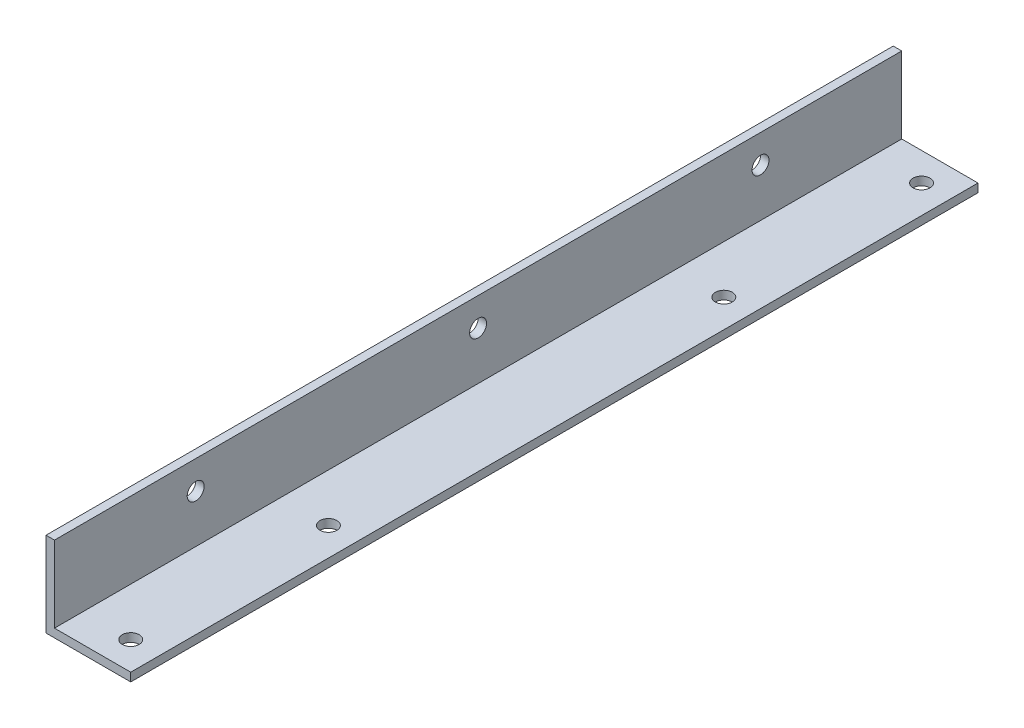
ISO-10303-21;
HEADER;
FILE_DESCRIPTION(('STEP AP214'),'2;1');
FILE_NAME('part.step','',(''),(''),'','','');
FILE_SCHEMA(('AUTOMOTIVE_DESIGN { 1 0 10303 214 1 1 1 1 }'));
ENDSEC;
DATA;
#1=APPLICATION_CONTEXT('core data for automotive mechanical design processes');
#2=APPLICATION_PROTOCOL_DEFINITION('international standard','automotive_design',2000,#1);
#3=PRODUCT_CONTEXT('',#1,'mechanical');
#4=PRODUCT('Part','Part','',(#3));
#5=PRODUCT_RELATED_PRODUCT_CATEGORY('part','',(#4));
#6=PRODUCT_DEFINITION_FORMATION('','',#4);
#7=PRODUCT_DEFINITION_CONTEXT('part definition',#1,'design');
#8=PRODUCT_DEFINITION('design','',#6,#7);
#9=PRODUCT_DEFINITION_SHAPE('','',#8);
#10=(LENGTH_UNIT() NAMED_UNIT(*) SI_UNIT(.MILLI.,.METRE.));
#11=(NAMED_UNIT(*) PLANE_ANGLE_UNIT() SI_UNIT($,.RADIAN.));
#12=(NAMED_UNIT(*) SI_UNIT($,.STERADIAN.) SOLID_ANGLE_UNIT());
#13=UNCERTAINTY_MEASURE_WITH_UNIT(LENGTH_MEASURE(1.E-05),#10,'distance_accuracy_value','');
#14=(GEOMETRIC_REPRESENTATION_CONTEXT(3) GLOBAL_UNCERTAINTY_ASSIGNED_CONTEXT((#13)) GLOBAL_UNIT_ASSIGNED_CONTEXT((#10,
#11,#12)) REPRESENTATION_CONTEXT('',''));
#15=CARTESIAN_POINT('',(0.,0.,0.));
#16=DIRECTION('',(0.,0.,1.));
#17=DIRECTION('',(1.,0.,0.));
#18=AXIS2_PLACEMENT_3D('',#15,#16,#17);
#19=CARTESIAN_POINT('',(0.,0.,-75.));
#20=DIRECTION('',(-1.,0.,0.));
#21=DIRECTION('',(0.,0.,1.));
#22=AXIS2_PLACEMENT_3D('',#19,#20,#21);
#23=PLANE('',#22);
#24=CARTESIAN_POINT('',(0.,10.,0.));
#25=DIRECTION('',(1.,0.,0.));
#26=DIRECTION('',(0.,0.,-1.));
#27=AXIS2_PLACEMENT_3D('',#24,#25,#26);
#28=CIRCLE('',#27,1.5);
#29=CARTESIAN_POINT('',(0.,10.,-1.5));
#30=VERTEX_POINT('',#29);
#31=EDGE_CURVE('E226',#30,#30,#28,.T.);
#32=ORIENTED_EDGE('',*,*,#31,.T.);
#33=EDGE_LOOP('',(#32));
#34=FACE_BOUND('',#33,.T.);
#35=CARTESIAN_POINT('',(0.,10.,50.));
#36=DIRECTION('',(1.,0.,0.));
#37=DIRECTION('',(0.,0.,-1.));
#38=AXIS2_PLACEMENT_3D('',#35,#36,#37);
#39=CIRCLE('',#38,1.5);
#40=CARTESIAN_POINT('',(0.,10.,48.5));
#41=VERTEX_POINT('',#40);
#42=EDGE_CURVE('E108',#41,#41,#39,.T.);
#43=ORIENTED_EDGE('',*,*,#42,.T.);
#44=EDGE_LOOP('',(#43));
#45=FACE_BOUND('',#44,.T.);
#46=DIRECTION('',(0.,0.,1.));
#47=VECTOR('',#46,1.);
#48=CARTESIAN_POINT('',(0.,0.,-75.));
#49=LINE('',#48,#47);
#50=CARTESIAN_POINT('',(0.,0.,-75.));
#51=VERTEX_POINT('',#50);
#52=CARTESIAN_POINT('',(0.,0.,75.));
#53=VERTEX_POINT('',#52);
#54=EDGE_CURVE('E83',#51,#53,#49,.T.);
#55=ORIENTED_EDGE('',*,*,#54,.T.);
#56=DIRECTION('',(0.,-1.,0.));
#57=VECTOR('',#56,1.);
#58=CARTESIAN_POINT('',(0.,0.,75.));
#59=LINE('',#58,#57);
#60=CARTESIAN_POINT('',(0.,15.,75.));
#61=VERTEX_POINT('',#60);
#62=EDGE_CURVE('E87',#61,#53,#59,.T.);
#63=ORIENTED_EDGE('',*,*,#62,.F.);
#64=DIRECTION('',(0.,0.,1.));
#65=VECTOR('',#64,1.);
#66=CARTESIAN_POINT('',(0.,15.,-75.));
#67=LINE('',#66,#65);
#68=CARTESIAN_POINT('',(0.,15.,-75.));
#69=VERTEX_POINT('',#68);
#70=EDGE_CURVE('E46',#69,#61,#67,.T.);
#71=ORIENTED_EDGE('',*,*,#70,.F.);
#72=DIRECTION('',(0.,-1.,0.));
#73=VECTOR('',#72,1.);
#74=CARTESIAN_POINT('',(0.,0.,-75.));
#75=LINE('',#74,#73);
#76=EDGE_CURVE('E88',#69,#51,#75,.T.);
#77=ORIENTED_EDGE('',*,*,#76,.T.);
#78=EDGE_LOOP('',(#55,#63,#71,#77));
#79=FACE_BOUND('',#78,.T.);
#80=CARTESIAN_POINT('',(0.,10.,-50.));
#81=DIRECTION('',(1.,0.,0.));
#82=DIRECTION('',(0.,0.,-1.));
#83=AXIS2_PLACEMENT_3D('',#80,#81,#82);
#84=CIRCLE('',#83,1.5);
#85=CARTESIAN_POINT('',(0.,10.,-51.5));
#86=VERTEX_POINT('',#85);
#87=EDGE_CURVE('E135',#86,#86,#84,.T.);
#88=ORIENTED_EDGE('',*,*,#87,.T.);
#89=EDGE_LOOP('',(#88));
#90=FACE_BOUND('',#89,.T.);
#91=ADVANCED_FACE('F31',(#34,#45,#79,#90),#23,.T.);
#92=CARTESIAN_POINT('',(0.,15.,-75.));
#93=DIRECTION('',(0.,1.,0.));
#94=DIRECTION('',(-1.,0.,0.));
#95=AXIS2_PLACEMENT_3D('',#92,#93,#94);
#96=PLANE('',#95);
#97=ORIENTED_EDGE('',*,*,#70,.T.);
#98=DIRECTION('',(-1.,0.,0.));
#99=VECTOR('',#98,1.);
#100=CARTESIAN_POINT('',(0.,15.,75.));
#101=LINE('',#100,#99);
#102=CARTESIAN_POINT('',(1.5,15.,75.));
#103=VERTEX_POINT('',#102);
#104=EDGE_CURVE('E107',#103,#61,#101,.T.);
#105=ORIENTED_EDGE('',*,*,#104,.F.);
#106=DIRECTION('',(0.,0.,1.));
#107=VECTOR('',#106,1.);
#108=CARTESIAN_POINT('',(1.5,15.,-75.));
#109=LINE('',#108,#107);
#110=CARTESIAN_POINT('',(1.5,15.,-75.));
#111=VERTEX_POINT('',#110);
#112=EDGE_CURVE('E54',#111,#103,#109,.T.);
#113=ORIENTED_EDGE('',*,*,#112,.F.);
#114=DIRECTION('',(-1.,0.,0.));
#115=VECTOR('',#114,1.);
#116=CARTESIAN_POINT('',(0.,15.,-75.));
#117=LINE('',#116,#115);
#118=EDGE_CURVE('E92',#111,#69,#117,.T.);
#119=ORIENTED_EDGE('',*,*,#118,.T.);
#120=EDGE_LOOP('',(#97,#105,#113,#119));
#121=FACE_BOUND('',#120,.T.);
#122=ADVANCED_FACE('F169',(#121),#96,.T.);
#123=CARTESIAN_POINT('',(1.5,1.5,-75.));
#124=DIRECTION('',(1.,0.,0.));
#125=DIRECTION('',(0.,0.,-1.));
#126=AXIS2_PLACEMENT_3D('',#123,#124,#125);
#127=PLANE('',#126);
#128=CARTESIAN_POINT('',(1.5,10.,0.));
#129=DIRECTION('',(1.,0.,0.));
#130=DIRECTION('',(0.,0.,-1.));
#131=AXIS2_PLACEMENT_3D('',#128,#129,#130);
#132=CIRCLE('',#131,1.5);
#133=CARTESIAN_POINT('',(1.5,10.,-1.5));
#134=VERTEX_POINT('',#133);
#135=EDGE_CURVE('E221',#134,#134,#132,.T.);
#136=ORIENTED_EDGE('',*,*,#135,.F.);
#137=EDGE_LOOP('',(#136));
#138=FACE_BOUND('',#137,.T.);
#139=CARTESIAN_POINT('',(1.5,10.,50.));
#140=DIRECTION('',(1.,0.,0.));
#141=DIRECTION('',(0.,0.,-1.));
#142=AXIS2_PLACEMENT_3D('',#139,#140,#141);
#143=CIRCLE('',#142,1.5);
#144=CARTESIAN_POINT('',(1.5,10.,48.5));
#145=VERTEX_POINT('',#144);
#146=EDGE_CURVE('E111',#145,#145,#143,.T.);
#147=ORIENTED_EDGE('',*,*,#146,.F.);
#148=EDGE_LOOP('',(#147));
#149=FACE_BOUND('',#148,.T.);
#150=ORIENTED_EDGE('',*,*,#112,.T.);
#151=DIRECTION('',(0.,1.,0.));
#152=VECTOR('',#151,1.);
#153=CARTESIAN_POINT('',(1.5,1.5,75.));
#154=LINE('',#153,#152);
#155=CARTESIAN_POINT('',(1.5,1.5,75.));
#156=VERTEX_POINT('',#155);
#157=EDGE_CURVE('E119',#156,#103,#154,.T.);
#158=ORIENTED_EDGE('',*,*,#157,.F.);
#159=DIRECTION('',(0.,0.,1.));
#160=VECTOR('',#159,1.);
#161=CARTESIAN_POINT('',(1.5,1.5,-75.));
#162=LINE('',#161,#160);
#163=CARTESIAN_POINT('',(1.5,1.5,-75.));
#164=VERTEX_POINT('',#163);
#165=EDGE_CURVE('E137',#164,#156,#162,.T.);
#166=ORIENTED_EDGE('',*,*,#165,.F.);
#167=DIRECTION('',(0.,1.,0.));
#168=VECTOR('',#167,1.);
#169=CARTESIAN_POINT('',(1.5,1.5,-75.));
#170=LINE('',#169,#168);
#171=EDGE_CURVE('E131',#164,#111,#170,.T.);
#172=ORIENTED_EDGE('',*,*,#171,.T.);
#173=EDGE_LOOP('',(#150,#158,#166,#172));
#174=FACE_BOUND('',#173,.T.);
#175=CARTESIAN_POINT('',(1.5,10.,-50.));
#176=DIRECTION('',(1.,0.,0.));
#177=DIRECTION('',(0.,0.,-1.));
#178=AXIS2_PLACEMENT_3D('',#175,#176,#177);
#179=CIRCLE('',#178,1.5);
#180=CARTESIAN_POINT('',(1.5,10.,-51.5));
#181=VERTEX_POINT('',#180);
#182=EDGE_CURVE('E144',#181,#181,#179,.T.);
#183=ORIENTED_EDGE('',*,*,#182,.F.);
#184=EDGE_LOOP('',(#183));
#185=FACE_BOUND('',#184,.T.);
#186=ADVANCED_FACE('F160',(#138,#149,#174,#185),#127,.T.);
#187=CARTESIAN_POINT('',(1.5,1.5,-75.));
#188=DIRECTION('',(0.,1.,0.));
#189=DIRECTION('',(0.,0.,1.));
#190=AXIS2_PLACEMENT_3D('',#187,#188,#189);
#191=PLANE('',#190);
#192=CARTESIAN_POINT('',(10.,1.5,35.));
#193=DIRECTION('',(0.,1.,0.));
#194=DIRECTION('',(0.,0.,1.));
#195=AXIS2_PLACEMENT_3D('',#192,#193,#194);
#196=CIRCLE('',#195,1.5);
#197=CARTESIAN_POINT('',(10.,1.5,33.5));
#198=VERTEX_POINT('',#197);
#199=EDGE_CURVE('E231',#198,#198,#196,.T.);
#200=ORIENTED_EDGE('',*,*,#199,.F.);
#201=EDGE_LOOP('',(#200));
#202=FACE_BOUND('',#201,.T.);
#203=CARTESIAN_POINT('',(10.,1.5,70.));
#204=DIRECTION('',(0.,1.,0.));
#205=DIRECTION('',(0.,0.,1.));
#206=AXIS2_PLACEMENT_3D('',#203,#204,#205);
#207=CIRCLE('',#206,1.5);
#208=CARTESIAN_POINT('',(10.,1.5,68.5));
#209=VERTEX_POINT('',#208);
#210=EDGE_CURVE('E220',#209,#209,#207,.T.);
#211=ORIENTED_EDGE('',*,*,#210,.F.);
#212=EDGE_LOOP('',(#211));
#213=FACE_BOUND('',#212,.T.);
#214=ORIENTED_EDGE('',*,*,#165,.T.);
#215=DIRECTION('',(-1.,0.,0.));
#216=VECTOR('',#215,1.);
#217=CARTESIAN_POINT('',(1.5,1.5,75.));
#218=LINE('',#217,#216);
#219=CARTESIAN_POINT('',(15.,1.5,75.));
#220=VERTEX_POINT('',#219);
#221=EDGE_CURVE('E116',#220,#156,#218,.T.);
#222=ORIENTED_EDGE('',*,*,#221,.F.);
#223=DIRECTION('',(0.,0.,1.));
#224=VECTOR('',#223,1.);
#225=CARTESIAN_POINT('',(15.,1.5,-75.));
#226=LINE('',#225,#224);
#227=CARTESIAN_POINT('',(15.,1.5,-75.));
#228=VERTEX_POINT('',#227);
#229=EDGE_CURVE('E139',#228,#220,#226,.T.);
#230=ORIENTED_EDGE('',*,*,#229,.F.);
#231=DIRECTION('',(-1.,0.,0.));
#232=VECTOR('',#231,1.);
#233=CARTESIAN_POINT('',(1.5,1.5,-75.));
#234=LINE('',#233,#232);
#235=EDGE_CURVE('E128',#228,#164,#234,.T.);
#236=ORIENTED_EDGE('',*,*,#235,.T.);
#237=EDGE_LOOP('',(#214,#222,#230,#236));
#238=FACE_BOUND('',#237,.T.);
#239=CARTESIAN_POINT('',(10.,1.5,-35.));
#240=DIRECTION('',(0.,1.,0.));
#241=DIRECTION('',(0.,0.,1.));
#242=AXIS2_PLACEMENT_3D('',#239,#240,#241);
#243=CIRCLE('',#242,1.5);
#244=CARTESIAN_POINT('',(10.,1.5,-36.5));
#245=VERTEX_POINT('',#244);
#246=EDGE_CURVE('E147',#245,#245,#243,.T.);
#247=ORIENTED_EDGE('',*,*,#246,.F.);
#248=EDGE_LOOP('',(#247));
#249=FACE_BOUND('',#248,.T.);
#250=CARTESIAN_POINT('',(10.,1.5,-70.));
#251=DIRECTION('',(0.,1.,0.));
#252=DIRECTION('',(0.,0.,1.));
#253=AXIS2_PLACEMENT_3D('',#250,#251,#252);
#254=CIRCLE('',#253,1.5);
#255=CARTESIAN_POINT('',(10.,1.5,-71.5));
#256=VERTEX_POINT('',#255);
#257=EDGE_CURVE('E39',#256,#256,#254,.T.);
#258=ORIENTED_EDGE('',*,*,#257,.F.);
#259=EDGE_LOOP('',(#258));
#260=FACE_BOUND('',#259,.T.);
#261=ADVANCED_FACE('F157',(#202,#213,#238,#249,#260),#191,.T.);
#262=CARTESIAN_POINT('',(15.,0.,-75.));
#263=DIRECTION('',(1.,0.,0.));
#264=DIRECTION('',(0.,0.,-1.));
#265=AXIS2_PLACEMENT_3D('',#262,#263,#264);
#266=PLANE('',#265);
#267=ORIENTED_EDGE('',*,*,#229,.T.);
#268=DIRECTION('',(0.,1.,0.));
#269=VECTOR('',#268,1.);
#270=CARTESIAN_POINT('',(15.,0.,75.));
#271=LINE('',#270,#269);
#272=CARTESIAN_POINT('',(15.,0.,75.));
#273=VERTEX_POINT('',#272);
#274=EDGE_CURVE('E102',#273,#220,#271,.T.);
#275=ORIENTED_EDGE('',*,*,#274,.F.);
#276=DIRECTION('',(0.,0.,1.));
#277=VECTOR('',#276,1.);
#278=CARTESIAN_POINT('',(15.,0.,-75.));
#279=LINE('',#278,#277);
#280=CARTESIAN_POINT('',(15.,0.,-75.));
#281=VERTEX_POINT('',#280);
#282=EDGE_CURVE('E91',#281,#273,#279,.T.);
#283=ORIENTED_EDGE('',*,*,#282,.F.);
#284=DIRECTION('',(0.,1.,0.));
#285=VECTOR('',#284,1.);
#286=CARTESIAN_POINT('',(15.,0.,-75.));
#287=LINE('',#286,#285);
#288=EDGE_CURVE('E125',#281,#228,#287,.T.);
#289=ORIENTED_EDGE('',*,*,#288,.T.);
#290=EDGE_LOOP('',(#267,#275,#283,#289));
#291=FACE_BOUND('',#290,.T.);
#292=ADVANCED_FACE('F159',(#291),#266,.T.);
#293=CARTESIAN_POINT('',(2.,0.,-75.));
#294=DIRECTION('',(0.,-1.,0.));
#295=DIRECTION('',(0.,0.,-1.));
#296=AXIS2_PLACEMENT_3D('',#293,#294,#295);
#297=PLANE('',#296);
#298=CARTESIAN_POINT('',(10.,0.,35.));
#299=DIRECTION('',(0.,-1.,0.));
#300=DIRECTION('',(0.,0.,-1.));
#301=AXIS2_PLACEMENT_3D('',#298,#299,#300);
#302=CIRCLE('',#301,1.5);
#303=CARTESIAN_POINT('',(10.,0.,33.5));
#304=VERTEX_POINT('',#303);
#305=EDGE_CURVE('E215',#304,#304,#302,.T.);
#306=ORIENTED_EDGE('',*,*,#305,.F.);
#307=EDGE_LOOP('',(#306));
#308=FACE_BOUND('',#307,.T.);
#309=CARTESIAN_POINT('',(10.,0.,70.));
#310=DIRECTION('',(0.,-1.,0.));
#311=DIRECTION('',(0.,0.,-1.));
#312=AXIS2_PLACEMENT_3D('',#309,#310,#311);
#313=CIRCLE('',#312,1.5);
#314=CARTESIAN_POINT('',(10.,0.,68.5));
#315=VERTEX_POINT('',#314);
#316=EDGE_CURVE('E218',#315,#315,#313,.T.);
#317=ORIENTED_EDGE('',*,*,#316,.F.);
#318=EDGE_LOOP('',(#317));
#319=FACE_BOUND('',#318,.T.);
#320=ORIENTED_EDGE('',*,*,#282,.T.);
#321=DIRECTION('',(1.,0.,0.));
#322=VECTOR('',#321,1.);
#323=CARTESIAN_POINT('',(0.,0.,75.));
#324=LINE('',#323,#322);
#325=EDGE_CURVE('E95',#53,#273,#324,.T.);
#326=ORIENTED_EDGE('',*,*,#325,.F.);
#327=ORIENTED_EDGE('',*,*,#54,.F.);
#328=DIRECTION('',(1.,0.,0.));
#329=VECTOR('',#328,1.);
#330=CARTESIAN_POINT('',(0.,0.,-75.));
#331=LINE('',#330,#329);
#332=EDGE_CURVE('E123',#51,#281,#331,.T.);
#333=ORIENTED_EDGE('',*,*,#332,.T.);
#334=EDGE_LOOP('',(#320,#326,#327,#333));
#335=FACE_BOUND('',#334,.T.);
#336=CARTESIAN_POINT('',(10.,0.,-35.));
#337=DIRECTION('',(0.,-1.,0.));
#338=DIRECTION('',(0.,0.,-1.));
#339=AXIS2_PLACEMENT_3D('',#336,#337,#338);
#340=CIRCLE('',#339,1.5);
#341=CARTESIAN_POINT('',(10.,0.,-36.5));
#342=VERTEX_POINT('',#341);
#343=EDGE_CURVE('E150',#342,#342,#340,.T.);
#344=ORIENTED_EDGE('',*,*,#343,.F.);
#345=EDGE_LOOP('',(#344));
#346=FACE_BOUND('',#345,.T.);
#347=CARTESIAN_POINT('',(10.,0.,-70.));
#348=DIRECTION('',(0.,-1.,0.));
#349=DIRECTION('',(0.,0.,-1.));
#350=AXIS2_PLACEMENT_3D('',#347,#348,#349);
#351=CIRCLE('',#350,1.5);
#352=CARTESIAN_POINT('',(10.,0.,-71.5));
#353=VERTEX_POINT('',#352);
#354=EDGE_CURVE('E11',#353,#353,#351,.T.);
#355=ORIENTED_EDGE('',*,*,#354,.F.);
#356=EDGE_LOOP('',(#355));
#357=FACE_BOUND('',#356,.T.);
#358=ADVANCED_FACE('F96',(#308,#319,#335,#346,#357),#297,.T.);
#359=CARTESIAN_POINT('',(0.,15.,-75.));
#360=DIRECTION('',(0.,0.,-1.));
#361=DIRECTION('',(-1.,0.,0.));
#362=AXIS2_PLACEMENT_3D('',#359,#360,#361);
#363=PLANE('',#362);
#364=ORIENTED_EDGE('',*,*,#76,.F.);
#365=ORIENTED_EDGE('',*,*,#118,.F.);
#366=ORIENTED_EDGE('',*,*,#171,.F.);
#367=ORIENTED_EDGE('',*,*,#235,.F.);
#368=ORIENTED_EDGE('',*,*,#288,.F.);
#369=ORIENTED_EDGE('',*,*,#332,.F.);
#370=EDGE_LOOP('',(#364,#365,#366,#367,#368,#369));
#371=FACE_BOUND('',#370,.T.);
#372=ADVANCED_FACE('F204',(#371),#363,.T.);
#373=CARTESIAN_POINT('',(0.,15.,75.));
#374=DIRECTION('',(0.,0.,-1.));
#375=DIRECTION('',(-1.,0.,0.));
#376=AXIS2_PLACEMENT_3D('',#373,#374,#375);
#377=PLANE('',#376);
#378=ORIENTED_EDGE('',*,*,#62,.T.);
#379=ORIENTED_EDGE('',*,*,#325,.T.);
#380=ORIENTED_EDGE('',*,*,#274,.T.);
#381=ORIENTED_EDGE('',*,*,#221,.T.);
#382=ORIENTED_EDGE('',*,*,#157,.T.);
#383=ORIENTED_EDGE('',*,*,#104,.T.);
#384=EDGE_LOOP('',(#378,#379,#380,#381,#382,#383));
#385=FACE_BOUND('',#384,.T.);
#386=ADVANCED_FACE('F105',(#385),#377,.F.);
#387=CARTESIAN_POINT('',(0.,10.,50.));
#388=DIRECTION('',(1.,0.,0.));
#389=DIRECTION('',(0.,0.,-1.));
#390=AXIS2_PLACEMENT_3D('',#387,#388,#389);
#391=CYLINDRICAL_SURFACE('',#390,1.5);
#392=ORIENTED_EDGE('',*,*,#42,.F.);
#393=EDGE_LOOP('',(#392));
#394=FACE_BOUND('',#393,.T.);
#395=ORIENTED_EDGE('',*,*,#146,.T.);
#396=EDGE_LOOP('',(#395));
#397=FACE_BOUND('',#396,.T.);
#398=ADVANCED_FACE('F257',(#394,#397),#391,.F.);
#399=CARTESIAN_POINT('',(10.,15.,70.));
#400=DIRECTION('',(0.,-1.,0.));
#401=DIRECTION('',(0.,0.,-1.));
#402=AXIS2_PLACEMENT_3D('',#399,#400,#401);
#403=CYLINDRICAL_SURFACE('',#402,1.5);
#404=CARTESIAN_POINT('',(10.,1.5,68.5));
#405=CARTESIAN_POINT('',(10.,1.484375,68.5));
#406=CARTESIAN_POINT('',(10.,1.46875,68.5));
#407=CARTESIAN_POINT('',(10.,1.4375,68.5));
#408=CARTESIAN_POINT('',(10.,1.421875,68.5));
#409=CARTESIAN_POINT('',(10.,1.390625,68.5));
#410=CARTESIAN_POINT('',(10.,1.375,68.5));
#411=CARTESIAN_POINT('',(10.,1.34375,68.5));
#412=CARTESIAN_POINT('',(10.,1.328125,68.5));
#413=CARTESIAN_POINT('',(10.,1.296875,68.5));
#414=CARTESIAN_POINT('',(10.,1.28125,68.5));
#415=CARTESIAN_POINT('',(10.,1.25,68.5));
#416=CARTESIAN_POINT('',(10.,1.234375,68.5));
#417=CARTESIAN_POINT('',(10.,1.203125,68.5));
#418=CARTESIAN_POINT('',(10.,1.1875,68.5));
#419=CARTESIAN_POINT('',(10.,1.15625,68.5));
#420=CARTESIAN_POINT('',(10.,1.140625,68.5));
#421=CARTESIAN_POINT('',(10.,1.109375,68.5));
#422=CARTESIAN_POINT('',(10.,1.09375,68.5));
#423=CARTESIAN_POINT('',(10.,1.0625,68.5));
#424=CARTESIAN_POINT('',(10.,1.046875,68.5));
#425=CARTESIAN_POINT('',(10.,1.015625,68.5));
#426=CARTESIAN_POINT('',(10.,0.999999999999999,68.5));
#427=CARTESIAN_POINT('',(10.,0.968749999999999,68.5));
#428=CARTESIAN_POINT('',(10.,0.953124999999999,68.5));
#429=CARTESIAN_POINT('',(10.,0.921874999999999,68.5));
#430=CARTESIAN_POINT('',(10.,0.906249999999999,68.5));
#431=CARTESIAN_POINT('',(10.,0.874999999999999,68.5));
#432=CARTESIAN_POINT('',(10.,0.859374999999999,68.5));
#433=CARTESIAN_POINT('',(10.,0.828124999999999,68.5));
#434=CARTESIAN_POINT('',(10.,0.812499999999999,68.5));
#435=CARTESIAN_POINT('',(10.,0.781249999999999,68.5));
#436=CARTESIAN_POINT('',(10.,0.765624999999999,68.5));
#437=CARTESIAN_POINT('',(10.,0.734374999999999,68.5));
#438=CARTESIAN_POINT('',(10.,0.718749999999999,68.5));
#439=CARTESIAN_POINT('',(10.,0.687499999999999,68.5));
#440=CARTESIAN_POINT('',(10.,0.671874999999999,68.5));
#441=CARTESIAN_POINT('',(10.,0.640624999999999,68.5));
#442=CARTESIAN_POINT('',(10.,0.624999999999999,68.5));
#443=CARTESIAN_POINT('',(10.,0.593749999999999,68.5));
#444=CARTESIAN_POINT('',(10.,0.578124999999999,68.5));
#445=CARTESIAN_POINT('',(10.,0.546874999999999,68.5));
#446=CARTESIAN_POINT('',(10.,0.531249999999999,68.5));
#447=CARTESIAN_POINT('',(10.,0.499999999999999,68.5));
#448=CARTESIAN_POINT('',(10.,0.484374999999999,68.5));
#449=CARTESIAN_POINT('',(10.,0.453124999999999,68.5));
#450=CARTESIAN_POINT('',(10.,0.437499999999999,68.5));
#451=CARTESIAN_POINT('',(10.,0.406249999999999,68.5));
#452=CARTESIAN_POINT('',(10.,0.390625,68.5));
#453=CARTESIAN_POINT('',(10.,0.359375,68.5));
#454=CARTESIAN_POINT('',(10.,0.343749999999999,68.5));
#455=CARTESIAN_POINT('',(10.,0.312499999999999,68.5));
#456=CARTESIAN_POINT('',(10.,0.296875,68.5));
#457=CARTESIAN_POINT('',(10.,0.265625,68.5));
#458=CARTESIAN_POINT('',(10.,0.25,68.5));
#459=CARTESIAN_POINT('',(10.,0.21875,68.5));
#460=CARTESIAN_POINT('',(10.,0.203125,68.5));
#461=CARTESIAN_POINT('',(10.,0.171875,68.5));
#462=CARTESIAN_POINT('',(10.,0.15625,68.5));
#463=CARTESIAN_POINT('',(10.,0.125,68.5));
#464=CARTESIAN_POINT('',(10.,0.109375,68.5));
#465=CARTESIAN_POINT('',(10.,0.0781250000000001,68.5));
#466=CARTESIAN_POINT('',(10.,0.0625000000000001,68.5));
#467=CARTESIAN_POINT('',(10.,0.03125,68.5));
#468=CARTESIAN_POINT('',(10.,0.015625,68.5));
#469=CARTESIAN_POINT('',(10.,0.,68.5));
#470=B_SPLINE_CURVE_WITH_KNOTS('',3,(#404,#405,#406,#407,#408,#409,#410,#411,#412,#413,#414,
#415,#416,#417,#418,#419,#420,#421,#422,#423,#424,#425,#426,#427,#428,#429,#430,#431,#432,#433,
#434,#435,#436,#437,#438,#439,#440,#441,#442,#443,#444,#445,#446,#447,#448,#449,#450,#451,#452,
#453,#454,#455,#456,#457,#458,#459,#460,#461,#462,#463,#464,#465,#466,#467,#468,#469),
.UNSPECIFIED.,.F.,.F.,(4,2,2,2,2,2,2,2,2,2,2,2,2,2,2,2,2,2,2,2,2,2,2,2,2,2,2,2,2,2,2,2,4),(0.,
0.046875,0.0937500000000001,0.140625,0.1875,0.234375,0.28125,0.328125,0.375,0.421874999999999,
0.468749999999999,0.515624999999999,0.562499999999999,0.609374999999999,0.656249999999999,
0.703124999999999,0.749999999999999,0.796874999999999,0.843749999999999,0.890624999999999,
0.937499999999999,0.984374999999999,1.03125,1.078125,1.125,1.171875,1.21875,1.265625,1.3125,
1.359375,1.40625,1.453125,1.5),.UNSPECIFIED.);
#471=EDGE_CURVE('BSEAM238',#209,#315,#470,.T.);
#472=ORIENTED_EDGE('',*,*,#210,.T.);
#473=ORIENTED_EDGE('',*,*,#316,.T.);
#474=ORIENTED_EDGE('',*,*,#471,.T.);
#475=ORIENTED_EDGE('',*,*,#471,.F.);
#476=EDGE_LOOP('',(#472,#474,#473,#475));
#477=FACE_BOUND('',#476,.T.);
#478=ADVANCED_FACE('F238',(#477),#403,.F.);
#479=CARTESIAN_POINT('',(0.,10.,0.));
#480=DIRECTION('',(1.,0.,0.));
#481=DIRECTION('',(0.,0.,-1.));
#482=AXIS2_PLACEMENT_3D('',#479,#480,#481);
#483=CYLINDRICAL_SURFACE('',#482,1.5);
#484=ORIENTED_EDGE('',*,*,#31,.F.);
#485=EDGE_LOOP('',(#484));
#486=FACE_BOUND('',#485,.T.);
#487=ORIENTED_EDGE('',*,*,#135,.T.);
#488=EDGE_LOOP('',(#487));
#489=FACE_BOUND('',#488,.T.);
#490=ADVANCED_FACE('F188',(#486,#489),#483,.F.);
#491=CARTESIAN_POINT('',(0.,10.,-50.));
#492=DIRECTION('',(1.,0.,0.));
#493=DIRECTION('',(0.,0.,-1.));
#494=AXIS2_PLACEMENT_3D('',#491,#492,#493);
#495=CYLINDRICAL_SURFACE('',#494,1.5);
#496=ORIENTED_EDGE('',*,*,#87,.F.);
#497=EDGE_LOOP('',(#496));
#498=FACE_BOUND('',#497,.T.);
#499=ORIENTED_EDGE('',*,*,#182,.T.);
#500=EDGE_LOOP('',(#499));
#501=FACE_BOUND('',#500,.T.);
#502=ADVANCED_FACE('F185',(#498,#501),#495,.F.);
#503=CARTESIAN_POINT('',(10.,15.,35.));
#504=DIRECTION('',(0.,-1.,0.));
#505=DIRECTION('',(0.,0.,-1.));
#506=AXIS2_PLACEMENT_3D('',#503,#504,#505);
#507=CYLINDRICAL_SURFACE('',#506,1.5);
#508=CARTESIAN_POINT('',(10.,1.5,33.5));
#509=CARTESIAN_POINT('',(10.,1.484375,33.5));
#510=CARTESIAN_POINT('',(10.,1.46875,33.5));
#511=CARTESIAN_POINT('',(10.,1.4375,33.5));
#512=CARTESIAN_POINT('',(10.,1.421875,33.5));
#513=CARTESIAN_POINT('',(10.,1.390625,33.5));
#514=CARTESIAN_POINT('',(10.,1.375,33.5));
#515=CARTESIAN_POINT('',(10.,1.34375,33.5));
#516=CARTESIAN_POINT('',(10.,1.328125,33.5));
#517=CARTESIAN_POINT('',(10.,1.296875,33.5));
#518=CARTESIAN_POINT('',(10.,1.28125,33.5));
#519=CARTESIAN_POINT('',(10.,1.25,33.5));
#520=CARTESIAN_POINT('',(10.,1.234375,33.5));
#521=CARTESIAN_POINT('',(10.,1.203125,33.5));
#522=CARTESIAN_POINT('',(10.,1.1875,33.5));
#523=CARTESIAN_POINT('',(10.,1.15625,33.5));
#524=CARTESIAN_POINT('',(10.,1.140625,33.5));
#525=CARTESIAN_POINT('',(10.,1.109375,33.5));
#526=CARTESIAN_POINT('',(10.,1.09375,33.5));
#527=CARTESIAN_POINT('',(10.,1.0625,33.5));
#528=CARTESIAN_POINT('',(10.,1.046875,33.5));
#529=CARTESIAN_POINT('',(10.,1.015625,33.5));
#530=CARTESIAN_POINT('',(10.,0.999999999999999,33.5));
#531=CARTESIAN_POINT('',(10.,0.968749999999999,33.5));
#532=CARTESIAN_POINT('',(10.,0.953124999999999,33.5));
#533=CARTESIAN_POINT('',(10.,0.921874999999999,33.5));
#534=CARTESIAN_POINT('',(10.,0.906249999999999,33.5));
#535=CARTESIAN_POINT('',(10.,0.874999999999999,33.5));
#536=CARTESIAN_POINT('',(10.,0.859374999999999,33.5));
#537=CARTESIAN_POINT('',(10.,0.828124999999999,33.5));
#538=CARTESIAN_POINT('',(10.,0.812499999999999,33.5));
#539=CARTESIAN_POINT('',(10.,0.781249999999999,33.5));
#540=CARTESIAN_POINT('',(10.,0.765624999999999,33.5));
#541=CARTESIAN_POINT('',(10.,0.734374999999999,33.5));
#542=CARTESIAN_POINT('',(10.,0.718749999999999,33.5));
#543=CARTESIAN_POINT('',(10.,0.687499999999999,33.5));
#544=CARTESIAN_POINT('',(10.,0.671874999999999,33.5));
#545=CARTESIAN_POINT('',(10.,0.640624999999999,33.5));
#546=CARTESIAN_POINT('',(10.,0.624999999999999,33.5));
#547=CARTESIAN_POINT('',(10.,0.593749999999999,33.5));
#548=CARTESIAN_POINT('',(10.,0.578124999999999,33.5));
#549=CARTESIAN_POINT('',(10.,0.546874999999999,33.5));
#550=CARTESIAN_POINT('',(10.,0.531249999999999,33.5));
#551=CARTESIAN_POINT('',(10.,0.499999999999999,33.5));
#552=CARTESIAN_POINT('',(10.,0.484374999999999,33.5));
#553=CARTESIAN_POINT('',(10.,0.453124999999999,33.5));
#554=CARTESIAN_POINT('',(10.,0.437499999999999,33.5));
#555=CARTESIAN_POINT('',(10.,0.406249999999999,33.5));
#556=CARTESIAN_POINT('',(10.,0.390625,33.5));
#557=CARTESIAN_POINT('',(10.,0.359375,33.5));
#558=CARTESIAN_POINT('',(10.,0.343749999999999,33.5));
#559=CARTESIAN_POINT('',(10.,0.312499999999999,33.5));
#560=CARTESIAN_POINT('',(10.,0.296875,33.5));
#561=CARTESIAN_POINT('',(10.,0.265625,33.5));
#562=CARTESIAN_POINT('',(10.,0.25,33.5));
#563=CARTESIAN_POINT('',(10.,0.21875,33.5));
#564=CARTESIAN_POINT('',(10.,0.203125,33.5));
#565=CARTESIAN_POINT('',(10.,0.171875,33.5));
#566=CARTESIAN_POINT('',(10.,0.15625,33.5));
#567=CARTESIAN_POINT('',(10.,0.125,33.5));
#568=CARTESIAN_POINT('',(10.,0.109375,33.5));
#569=CARTESIAN_POINT('',(10.,0.0781250000000001,33.5));
#570=CARTESIAN_POINT('',(10.,0.0625000000000001,33.5));
#571=CARTESIAN_POINT('',(10.,0.03125,33.5));
#572=CARTESIAN_POINT('',(10.,0.015625,33.5));
#573=CARTESIAN_POINT('',(10.,0.,33.5));
#574=B_SPLINE_CURVE_WITH_KNOTS('',3,(#508,#509,#510,#511,#512,#513,#514,#515,#516,#517,#518,
#519,#520,#521,#522,#523,#524,#525,#526,#527,#528,#529,#530,#531,#532,#533,#534,#535,#536,#537,
#538,#539,#540,#541,#542,#543,#544,#545,#546,#547,#548,#549,#550,#551,#552,#553,#554,#555,#556,
#557,#558,#559,#560,#561,#562,#563,#564,#565,#566,#567,#568,#569,#570,#571,#572,#573),
.UNSPECIFIED.,.F.,.F.,(4,2,2,2,2,2,2,2,2,2,2,2,2,2,2,2,2,2,2,2,2,2,2,2,2,2,2,2,2,2,2,2,4),(0.,
0.046875,0.0937500000000001,0.140625,0.1875,0.234375,0.28125,0.328125,0.375,0.421874999999999,
0.468749999999999,0.515624999999999,0.562499999999999,0.609374999999999,0.656249999999999,
0.703124999999999,0.749999999999999,0.796874999999999,0.843749999999999,0.890624999999999,
0.937499999999999,0.984374999999999,1.03125,1.078125,1.125,1.171875,1.21875,1.265625,1.3125,
1.359375,1.40625,1.453125,1.5),.UNSPECIFIED.);
#575=EDGE_CURVE('BSEAM187',#198,#304,#574,.T.);
#576=ORIENTED_EDGE('',*,*,#199,.T.);
#577=ORIENTED_EDGE('',*,*,#305,.T.);
#578=ORIENTED_EDGE('',*,*,#575,.T.);
#579=ORIENTED_EDGE('',*,*,#575,.F.);
#580=EDGE_LOOP('',(#576,#578,#577,#579));
#581=FACE_BOUND('',#580,.T.);
#582=ADVANCED_FACE('F187',(#581),#507,.F.);
#583=CARTESIAN_POINT('',(10.,15.,-35.));
#584=DIRECTION('',(0.,-1.,0.));
#585=DIRECTION('',(0.,0.,-1.));
#586=AXIS2_PLACEMENT_3D('',#583,#584,#585);
#587=CYLINDRICAL_SURFACE('',#586,1.5);
#588=CARTESIAN_POINT('',(10.,1.5,-36.5));
#589=CARTESIAN_POINT('',(10.,1.484375,-36.5));
#590=CARTESIAN_POINT('',(10.,1.46875,-36.5));
#591=CARTESIAN_POINT('',(10.,1.4375,-36.5));
#592=CARTESIAN_POINT('',(10.,1.421875,-36.5));
#593=CARTESIAN_POINT('',(10.,1.390625,-36.5));
#594=CARTESIAN_POINT('',(10.,1.375,-36.5));
#595=CARTESIAN_POINT('',(10.,1.34375,-36.5));
#596=CARTESIAN_POINT('',(10.,1.328125,-36.5));
#597=CARTESIAN_POINT('',(10.,1.296875,-36.5));
#598=CARTESIAN_POINT('',(10.,1.28125,-36.5));
#599=CARTESIAN_POINT('',(10.,1.25,-36.5));
#600=CARTESIAN_POINT('',(10.,1.234375,-36.5));
#601=CARTESIAN_POINT('',(10.,1.203125,-36.5));
#602=CARTESIAN_POINT('',(10.,1.1875,-36.5));
#603=CARTESIAN_POINT('',(10.,1.15625,-36.5));
#604=CARTESIAN_POINT('',(10.,1.140625,-36.5));
#605=CARTESIAN_POINT('',(10.,1.109375,-36.5));
#606=CARTESIAN_POINT('',(10.,1.09375,-36.5));
#607=CARTESIAN_POINT('',(10.,1.0625,-36.5));
#608=CARTESIAN_POINT('',(10.,1.046875,-36.5));
#609=CARTESIAN_POINT('',(10.,1.015625,-36.5));
#610=CARTESIAN_POINT('',(10.,0.999999999999999,-36.5));
#611=CARTESIAN_POINT('',(10.,0.968749999999999,-36.5));
#612=CARTESIAN_POINT('',(10.,0.953124999999999,-36.5));
#613=CARTESIAN_POINT('',(10.,0.921874999999999,-36.5));
#614=CARTESIAN_POINT('',(10.,0.906249999999999,-36.5));
#615=CARTESIAN_POINT('',(10.,0.874999999999999,-36.5));
#616=CARTESIAN_POINT('',(10.,0.859374999999999,-36.5));
#617=CARTESIAN_POINT('',(10.,0.828124999999999,-36.5));
#618=CARTESIAN_POINT('',(10.,0.812499999999999,-36.5));
#619=CARTESIAN_POINT('',(10.,0.781249999999999,-36.5));
#620=CARTESIAN_POINT('',(10.,0.765624999999999,-36.5));
#621=CARTESIAN_POINT('',(10.,0.734374999999999,-36.5));
#622=CARTESIAN_POINT('',(10.,0.718749999999999,-36.5));
#623=CARTESIAN_POINT('',(10.,0.687499999999999,-36.5));
#624=CARTESIAN_POINT('',(10.,0.671874999999999,-36.5));
#625=CARTESIAN_POINT('',(10.,0.640624999999999,-36.5));
#626=CARTESIAN_POINT('',(10.,0.624999999999999,-36.5));
#627=CARTESIAN_POINT('',(10.,0.593749999999999,-36.5));
#628=CARTESIAN_POINT('',(10.,0.578124999999999,-36.5));
#629=CARTESIAN_POINT('',(10.,0.546874999999999,-36.5));
#630=CARTESIAN_POINT('',(10.,0.531249999999999,-36.5));
#631=CARTESIAN_POINT('',(10.,0.499999999999999,-36.5));
#632=CARTESIAN_POINT('',(10.,0.484374999999999,-36.5));
#633=CARTESIAN_POINT('',(10.,0.453124999999999,-36.5));
#634=CARTESIAN_POINT('',(10.,0.437499999999999,-36.5));
#635=CARTESIAN_POINT('',(10.,0.406249999999999,-36.5));
#636=CARTESIAN_POINT('',(10.,0.390625,-36.5));
#637=CARTESIAN_POINT('',(10.,0.359375,-36.5));
#638=CARTESIAN_POINT('',(10.,0.343749999999999,-36.5));
#639=CARTESIAN_POINT('',(10.,0.312499999999999,-36.5));
#640=CARTESIAN_POINT('',(10.,0.296875,-36.5));
#641=CARTESIAN_POINT('',(10.,0.265625,-36.5));
#642=CARTESIAN_POINT('',(10.,0.25,-36.5));
#643=CARTESIAN_POINT('',(10.,0.21875,-36.5));
#644=CARTESIAN_POINT('',(10.,0.203125,-36.5));
#645=CARTESIAN_POINT('',(10.,0.171875,-36.5));
#646=CARTESIAN_POINT('',(10.,0.15625,-36.5));
#647=CARTESIAN_POINT('',(10.,0.125,-36.5));
#648=CARTESIAN_POINT('',(10.,0.109375,-36.5));
#649=CARTESIAN_POINT('',(10.,0.0781250000000001,-36.5));
#650=CARTESIAN_POINT('',(10.,0.0625000000000001,-36.5));
#651=CARTESIAN_POINT('',(10.,0.03125,-36.5));
#652=CARTESIAN_POINT('',(10.,0.015625,-36.5));
#653=CARTESIAN_POINT('',(10.,0.,-36.5));
#654=B_SPLINE_CURVE_WITH_KNOTS('',3,(#588,#589,#590,#591,#592,#593,#594,#595,#596,#597,#598,
#599,#600,#601,#602,#603,#604,#605,#606,#607,#608,#609,#610,#611,#612,#613,#614,#615,#616,#617,
#618,#619,#620,#621,#622,#623,#624,#625,#626,#627,#628,#629,#630,#631,#632,#633,#634,#635,#636,
#637,#638,#639,#640,#641,#642,#643,#644,#645,#646,#647,#648,#649,#650,#651,#652,#653),
.UNSPECIFIED.,.F.,.F.,(4,2,2,2,2,2,2,2,2,2,2,2,2,2,2,2,2,2,2,2,2,2,2,2,2,2,2,2,2,2,2,2,4),(0.,
0.046875,0.0937500000000001,0.140625,0.1875,0.234375,0.28125,0.328125,0.375,0.421874999999999,
0.468749999999999,0.515624999999999,0.562499999999999,0.609374999999999,0.656249999999999,
0.703124999999999,0.749999999999999,0.796874999999999,0.843749999999999,0.890624999999999,
0.937499999999999,0.984374999999999,1.03125,1.078125,1.125,1.171875,1.21875,1.265625,1.3125,
1.359375,1.40625,1.453125,1.5),.UNSPECIFIED.);
#655=EDGE_CURVE('BSEAM190',#245,#342,#654,.T.);
#656=ORIENTED_EDGE('',*,*,#246,.T.);
#657=ORIENTED_EDGE('',*,*,#343,.T.);
#658=ORIENTED_EDGE('',*,*,#655,.T.);
#659=ORIENTED_EDGE('',*,*,#655,.F.);
#660=EDGE_LOOP('',(#656,#658,#657,#659));
#661=FACE_BOUND('',#660,.T.);
#662=ADVANCED_FACE('F190',(#661),#587,.F.);
#663=CARTESIAN_POINT('',(10.,15.,-70.));
#664=DIRECTION('',(0.,-1.,0.));
#665=DIRECTION('',(0.,0.,-1.));
#666=AXIS2_PLACEMENT_3D('',#663,#664,#665);
#667=CYLINDRICAL_SURFACE('',#666,1.5);
#668=CARTESIAN_POINT('',(10.,1.5,-71.5));
#669=CARTESIAN_POINT('',(10.,1.484375,-71.5));
#670=CARTESIAN_POINT('',(10.,1.46875,-71.5));
#671=CARTESIAN_POINT('',(10.,1.4375,-71.5));
#672=CARTESIAN_POINT('',(10.,1.421875,-71.5));
#673=CARTESIAN_POINT('',(10.,1.390625,-71.5));
#674=CARTESIAN_POINT('',(10.,1.375,-71.5));
#675=CARTESIAN_POINT('',(10.,1.34375,-71.5));
#676=CARTESIAN_POINT('',(10.,1.328125,-71.5));
#677=CARTESIAN_POINT('',(10.,1.296875,-71.5));
#678=CARTESIAN_POINT('',(10.,1.28125,-71.5));
#679=CARTESIAN_POINT('',(10.,1.25,-71.5));
#680=CARTESIAN_POINT('',(10.,1.234375,-71.5));
#681=CARTESIAN_POINT('',(10.,1.203125,-71.5));
#682=CARTESIAN_POINT('',(10.,1.1875,-71.5));
#683=CARTESIAN_POINT('',(10.,1.15625,-71.5));
#684=CARTESIAN_POINT('',(10.,1.140625,-71.5));
#685=CARTESIAN_POINT('',(10.,1.109375,-71.5));
#686=CARTESIAN_POINT('',(10.,1.09375,-71.5));
#687=CARTESIAN_POINT('',(10.,1.0625,-71.5));
#688=CARTESIAN_POINT('',(10.,1.046875,-71.5));
#689=CARTESIAN_POINT('',(10.,1.015625,-71.5));
#690=CARTESIAN_POINT('',(10.,0.999999999999999,-71.5));
#691=CARTESIAN_POINT('',(10.,0.968749999999999,-71.5));
#692=CARTESIAN_POINT('',(10.,0.953124999999999,-71.5));
#693=CARTESIAN_POINT('',(10.,0.921874999999999,-71.5));
#694=CARTESIAN_POINT('',(10.,0.906249999999999,-71.5));
#695=CARTESIAN_POINT('',(10.,0.874999999999999,-71.5));
#696=CARTESIAN_POINT('',(10.,0.859374999999999,-71.5));
#697=CARTESIAN_POINT('',(10.,0.828124999999999,-71.5));
#698=CARTESIAN_POINT('',(10.,0.812499999999999,-71.5));
#699=CARTESIAN_POINT('',(10.,0.781249999999999,-71.5));
#700=CARTESIAN_POINT('',(10.,0.765624999999999,-71.5));
#701=CARTESIAN_POINT('',(10.,0.734374999999999,-71.5));
#702=CARTESIAN_POINT('',(10.,0.718749999999999,-71.5));
#703=CARTESIAN_POINT('',(10.,0.687499999999999,-71.5));
#704=CARTESIAN_POINT('',(10.,0.671874999999999,-71.5));
#705=CARTESIAN_POINT('',(10.,0.640624999999999,-71.5));
#706=CARTESIAN_POINT('',(10.,0.624999999999999,-71.5));
#707=CARTESIAN_POINT('',(10.,0.593749999999999,-71.5));
#708=CARTESIAN_POINT('',(10.,0.578124999999999,-71.5));
#709=CARTESIAN_POINT('',(10.,0.546874999999999,-71.5));
#710=CARTESIAN_POINT('',(10.,0.531249999999999,-71.5));
#711=CARTESIAN_POINT('',(10.,0.499999999999999,-71.5));
#712=CARTESIAN_POINT('',(10.,0.484374999999999,-71.5));
#713=CARTESIAN_POINT('',(10.,0.453124999999999,-71.5));
#714=CARTESIAN_POINT('',(10.,0.437499999999999,-71.5));
#715=CARTESIAN_POINT('',(10.,0.406249999999999,-71.5));
#716=CARTESIAN_POINT('',(10.,0.390625,-71.5));
#717=CARTESIAN_POINT('',(10.,0.359375,-71.5));
#718=CARTESIAN_POINT('',(10.,0.343749999999999,-71.5));
#719=CARTESIAN_POINT('',(10.,0.312499999999999,-71.5));
#720=CARTESIAN_POINT('',(10.,0.296875,-71.5));
#721=CARTESIAN_POINT('',(10.,0.265625,-71.5));
#722=CARTESIAN_POINT('',(10.,0.25,-71.5));
#723=CARTESIAN_POINT('',(10.,0.21875,-71.5));
#724=CARTESIAN_POINT('',(10.,0.203125,-71.5));
#725=CARTESIAN_POINT('',(10.,0.171875,-71.5));
#726=CARTESIAN_POINT('',(10.,0.15625,-71.5));
#727=CARTESIAN_POINT('',(10.,0.125,-71.5));
#728=CARTESIAN_POINT('',(10.,0.109375,-71.5));
#729=CARTESIAN_POINT('',(10.,0.0781250000000001,-71.5));
#730=CARTESIAN_POINT('',(10.,0.0625000000000001,-71.5));
#731=CARTESIAN_POINT('',(10.,0.03125,-71.5));
#732=CARTESIAN_POINT('',(10.,0.015625,-71.5));
#733=CARTESIAN_POINT('',(10.,0.,-71.5));
#734=B_SPLINE_CURVE_WITH_KNOTS('',3,(#668,#669,#670,#671,#672,#673,#674,#675,#676,#677,#678,
#679,#680,#681,#682,#683,#684,#685,#686,#687,#688,#689,#690,#691,#692,#693,#694,#695,#696,#697,
#698,#699,#700,#701,#702,#703,#704,#705,#706,#707,#708,#709,#710,#711,#712,#713,#714,#715,#716,
#717,#718,#719,#720,#721,#722,#723,#724,#725,#726,#727,#728,#729,#730,#731,#732,#733),
.UNSPECIFIED.,.F.,.F.,(4,2,2,2,2,2,2,2,2,2,2,2,2,2,2,2,2,2,2,2,2,2,2,2,2,2,2,2,2,2,2,2,4),(0.,
0.046875,0.0937500000000001,0.140625,0.1875,0.234375,0.28125,0.328125,0.375,0.421874999999999,
0.468749999999999,0.515624999999999,0.562499999999999,0.609374999999999,0.656249999999999,
0.703124999999999,0.749999999999999,0.796874999999999,0.843749999999999,0.890624999999999,
0.937499999999999,0.984374999999999,1.03125,1.078125,1.125,1.171875,1.21875,1.265625,1.3125,
1.359375,1.40625,1.453125,1.5),.UNSPECIFIED.);
#735=EDGE_CURVE('BSEAM33',#256,#353,#734,.T.);
#736=ORIENTED_EDGE('',*,*,#257,.T.);
#737=ORIENTED_EDGE('',*,*,#354,.T.);
#738=ORIENTED_EDGE('',*,*,#735,.T.);
#739=ORIENTED_EDGE('',*,*,#735,.F.);
#740=EDGE_LOOP('',(#736,#738,#737,#739));
#741=FACE_BOUND('',#740,.T.);
#742=ADVANCED_FACE('F33',(#741),#667,.F.);
#743=CLOSED_SHELL('',(#91,#122,#186,#261,#292,#358,#372,#386,#398,#478,#490,#502,#582,#662,#742));
#744=MANIFOLD_SOLID_BREP('B2',#743);
#745=ADVANCED_BREP_SHAPE_REPRESENTATION('',(#18,#744),#14);
#746=SHAPE_DEFINITION_REPRESENTATION(#9,#745);
ENDSEC;
END-ISO-10303-21;
